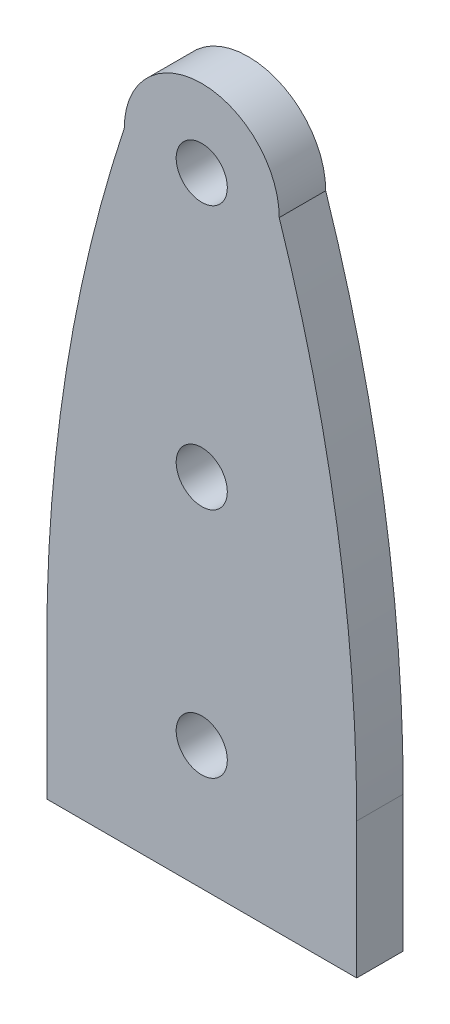
ISO-10303-21;
HEADER;
FILE_DESCRIPTION(('STEP AP214'),'2;1');
FILE_NAME('part.step','',(''),(''),'','','');
FILE_SCHEMA(('AUTOMOTIVE_DESIGN { 1 0 10303 214 1 1 1 1 }'));
ENDSEC;
DATA;
#1=APPLICATION_CONTEXT('core data for automotive mechanical design processes');
#2=APPLICATION_PROTOCOL_DEFINITION('international standard','automotive_design',2000,#1);
#3=PRODUCT_CONTEXT('',#1,'mechanical');
#4=PRODUCT('Part','Part','',(#3));
#5=PRODUCT_RELATED_PRODUCT_CATEGORY('part','',(#4));
#6=PRODUCT_DEFINITION_FORMATION('','',#4);
#7=PRODUCT_DEFINITION_CONTEXT('part definition',#1,'design');
#8=PRODUCT_DEFINITION('design','',#6,#7);
#9=PRODUCT_DEFINITION_SHAPE('','',#8);
#10=(LENGTH_UNIT() NAMED_UNIT(*) SI_UNIT(.MILLI.,.METRE.));
#11=(NAMED_UNIT(*) PLANE_ANGLE_UNIT() SI_UNIT($,.RADIAN.));
#12=(NAMED_UNIT(*) SI_UNIT($,.STERADIAN.) SOLID_ANGLE_UNIT());
#13=UNCERTAINTY_MEASURE_WITH_UNIT(LENGTH_MEASURE(1.E-05),#10,'distance_accuracy_value','');
#14=(GEOMETRIC_REPRESENTATION_CONTEXT(3) GLOBAL_UNCERTAINTY_ASSIGNED_CONTEXT((#13)) GLOBAL_UNIT_ASSIGNED_CONTEXT((#10,
#11,#12)) REPRESENTATION_CONTEXT('',''));
#15=CARTESIAN_POINT('',(0.,0.,0.));
#16=DIRECTION('',(0.,0.,1.));
#17=DIRECTION('',(1.,0.,0.));
#18=AXIS2_PLACEMENT_3D('',#15,#16,#17);
#19=CARTESIAN_POINT('',(10.,40.,3.));
#20=DIRECTION('',(0.,0.,1.));
#21=DIRECTION('',(1.,0.,0.));
#22=AXIS2_PLACEMENT_3D('',#19,#20,#21);
#23=PLANE('',#22);
#24=CARTESIAN_POINT('',(10.,40.,3.));
#25=DIRECTION('',(0.,0.,-1.));
#26=DIRECTION('',(1.,0.,0.));
#27=AXIS2_PLACEMENT_3D('',#24,#25,#26);
#28=CIRCLE('',#27,5.);
#29=CARTESIAN_POINT('',(5.,40.,3.));
#30=VERTEX_POINT('',#29);
#31=CARTESIAN_POINT('',(15.,40.,3.));
#32=VERTEX_POINT('',#31);
#33=EDGE_CURVE('E92',#30,#32,#28,.T.);
#34=ORIENTED_EDGE('',*,*,#33,.F.);
#35=CARTESIAN_POINT('',(100.,8.77501000800804,3.));
#36=DIRECTION('',(0.,0.,1.));
#37=DIRECTION('',(1.,0.,0.));
#38=AXIS2_PLACEMENT_3D('',#35,#36,#37);
#39=CIRCLE('',#38,100.);
#40=CARTESIAN_POINT('',(0.,8.77501000800804,3.));
#41=VERTEX_POINT('',#40);
#42=EDGE_CURVE('E42',#30,#41,#39,.T.);
#43=ORIENTED_EDGE('',*,*,#42,.T.);
#44=DIRECTION('',(0.,-1.,0.));
#45=VECTOR('',#44,1.);
#46=CARTESIAN_POINT('',(0.,40.,3.));
#47=LINE('',#46,#45);
#48=CARTESIAN_POINT('',(0.,0.,3.));
#49=VERTEX_POINT('',#48);
#50=EDGE_CURVE('E125',#41,#49,#47,.T.);
#51=ORIENTED_EDGE('',*,*,#50,.T.);
#52=DIRECTION('',(1.,0.,0.));
#53=VECTOR('',#52,1.);
#54=CARTESIAN_POINT('',(0.,0.,3.));
#55=LINE('',#54,#53);
#56=CARTESIAN_POINT('',(20.,0.,3.));
#57=VERTEX_POINT('',#56);
#58=EDGE_CURVE('E132',#49,#57,#55,.T.);
#59=ORIENTED_EDGE('',*,*,#58,.T.);
#60=DIRECTION('',(0.,1.,0.));
#61=VECTOR('',#60,1.);
#62=CARTESIAN_POINT('',(20.,0.,3.));
#63=LINE('',#62,#61);
#64=CARTESIAN_POINT('',(20.,8.77501000800798,3.));
#65=VERTEX_POINT('',#64);
#66=EDGE_CURVE('E122',#57,#65,#63,.T.);
#67=ORIENTED_EDGE('',*,*,#66,.T.);
#68=CARTESIAN_POINT('',(-80.,8.77501000800798,3.));
#69=DIRECTION('',(0.,0.,1.));
#70=DIRECTION('',(1.,0.,0.));
#71=AXIS2_PLACEMENT_3D('',#68,#69,#70);
#72=CIRCLE('',#71,100.);
#73=EDGE_CURVE('E103',#65,#32,#72,.T.);
#74=ORIENTED_EDGE('',*,*,#73,.T.);
#75=EDGE_LOOP('',(#34,#43,#51,#59,#67,#74));
#76=FACE_BOUND('',#75,.T.);
#77=CARTESIAN_POINT('',(10.,8.,3.));
#78=DIRECTION('',(0.,0.,1.));
#79=DIRECTION('',(1.,0.,0.));
#80=AXIS2_PLACEMENT_3D('',#77,#78,#79);
#81=CIRCLE('',#80,1.65);
#82=CARTESIAN_POINT('',(11.65,8.,3.));
#83=VERTEX_POINT('',#82);
#84=EDGE_CURVE('E138',#83,#83,#81,.T.);
#85=ORIENTED_EDGE('',*,*,#84,.F.);
#86=EDGE_LOOP('',(#85));
#87=FACE_BOUND('',#86,.T.);
#88=CARTESIAN_POINT('',(10.,40.,3.));
#89=DIRECTION('',(0.,0.,1.));
#90=DIRECTION('',(1.,0.,0.));
#91=AXIS2_PLACEMENT_3D('',#88,#89,#90);
#92=CIRCLE('',#91,1.65);
#93=CARTESIAN_POINT('',(11.65,40.,3.));
#94=VERTEX_POINT('',#93);
#95=EDGE_CURVE('E130',#94,#94,#92,.T.);
#96=ORIENTED_EDGE('',*,*,#95,.F.);
#97=EDGE_LOOP('',(#96));
#98=FACE_BOUND('',#97,.T.);
#99=CARTESIAN_POINT('',(10.,23.,3.));
#100=DIRECTION('',(0.,0.,1.));
#101=DIRECTION('',(1.,0.,0.));
#102=AXIS2_PLACEMENT_3D('',#99,#100,#101);
#103=CIRCLE('',#102,1.65);
#104=CARTESIAN_POINT('',(11.65,23.,3.));
#105=VERTEX_POINT('',#104);
#106=EDGE_CURVE('E144',#105,#105,#103,.T.);
#107=ORIENTED_EDGE('',*,*,#106,.F.);
#108=EDGE_LOOP('',(#107));
#109=FACE_BOUND('',#108,.T.);
#110=ADVANCED_FACE('F34',(#76,#87,#98,#109),#23,.T.);
#111=CARTESIAN_POINT('',(10.,40.,0.));
#112=DIRECTION('',(0.,0.,1.));
#113=DIRECTION('',(1.,0.,0.));
#114=AXIS2_PLACEMENT_3D('',#111,#112,#113);
#115=PLANE('',#114);
#116=DIRECTION('',(0.,-1.,0.));
#117=VECTOR('',#116,1.);
#118=CARTESIAN_POINT('',(0.,40.,0.));
#119=LINE('',#118,#117);
#120=CARTESIAN_POINT('',(0.,8.77501000800804,0.));
#121=VERTEX_POINT('',#120);
#122=CARTESIAN_POINT('',(0.,0.,0.));
#123=VERTEX_POINT('',#122);
#124=EDGE_CURVE('E128',#121,#123,#119,.T.);
#125=ORIENTED_EDGE('',*,*,#124,.F.);
#126=CARTESIAN_POINT('',(100.,8.77501000800804,0.));
#127=DIRECTION('',(0.,0.,1.));
#128=DIRECTION('',(1.,0.,0.));
#129=AXIS2_PLACEMENT_3D('',#126,#127,#128);
#130=CIRCLE('',#129,100.);
#131=CARTESIAN_POINT('',(5.,40.,0.));
#132=VERTEX_POINT('',#131);
#133=EDGE_CURVE('E109',#121,#132,#130,.F.);
#134=ORIENTED_EDGE('',*,*,#133,.T.);
#135=CARTESIAN_POINT('',(10.,40.,0.));
#136=DIRECTION('',(0.,0.,1.));
#137=DIRECTION('',(1.,0.,0.));
#138=AXIS2_PLACEMENT_3D('',#135,#136,#137);
#139=CIRCLE('',#138,5.);
#140=CARTESIAN_POINT('',(15.,40.,0.));
#141=VERTEX_POINT('',#140);
#142=EDGE_CURVE('E94',#132,#141,#139,.F.);
#143=ORIENTED_EDGE('',*,*,#142,.T.);
#144=CARTESIAN_POINT('',(-80.,8.77501000800798,0.));
#145=DIRECTION('',(0.,0.,1.));
#146=DIRECTION('',(1.,0.,0.));
#147=AXIS2_PLACEMENT_3D('',#144,#145,#146);
#148=CIRCLE('',#147,100.);
#149=CARTESIAN_POINT('',(20.,8.77501000800798,0.));
#150=VERTEX_POINT('',#149);
#151=EDGE_CURVE('E55',#141,#150,#148,.F.);
#152=ORIENTED_EDGE('',*,*,#151,.T.);
#153=DIRECTION('',(0.,1.,0.));
#154=VECTOR('',#153,1.);
#155=CARTESIAN_POINT('',(20.,0.,0.));
#156=LINE('',#155,#154);
#157=CARTESIAN_POINT('',(20.,0.,0.));
#158=VERTEX_POINT('',#157);
#159=EDGE_CURVE('E123',#158,#150,#156,.T.);
#160=ORIENTED_EDGE('',*,*,#159,.F.);
#161=DIRECTION('',(1.,0.,0.));
#162=VECTOR('',#161,1.);
#163=CARTESIAN_POINT('',(0.,0.,0.));
#164=LINE('',#163,#162);
#165=EDGE_CURVE('E126',#123,#158,#164,.T.);
#166=ORIENTED_EDGE('',*,*,#165,.F.);
#167=EDGE_LOOP('',(#125,#134,#143,#152,#160,#166));
#168=FACE_BOUND('',#167,.T.);
#169=CARTESIAN_POINT('',(10.,40.,0.));
#170=DIRECTION('',(0.,0.,1.));
#171=DIRECTION('',(1.,0.,0.));
#172=AXIS2_PLACEMENT_3D('',#169,#170,#171);
#173=CIRCLE('',#172,1.65);
#174=CARTESIAN_POINT('',(11.65,40.,0.));
#175=VERTEX_POINT('',#174);
#176=EDGE_CURVE('E135',#175,#175,#173,.T.);
#177=ORIENTED_EDGE('',*,*,#176,.T.);
#178=EDGE_LOOP('',(#177));
#179=FACE_BOUND('',#178,.T.);
#180=CARTESIAN_POINT('',(10.,8.,0.));
#181=DIRECTION('',(0.,0.,1.));
#182=DIRECTION('',(1.,0.,0.));
#183=AXIS2_PLACEMENT_3D('',#180,#181,#182);
#184=CIRCLE('',#183,1.65);
#185=CARTESIAN_POINT('',(11.65,8.,0.));
#186=VERTEX_POINT('',#185);
#187=EDGE_CURVE('E141',#186,#186,#184,.T.);
#188=ORIENTED_EDGE('',*,*,#187,.T.);
#189=EDGE_LOOP('',(#188));
#190=FACE_BOUND('',#189,.T.);
#191=CARTESIAN_POINT('',(10.,23.,0.));
#192=DIRECTION('',(0.,0.,1.));
#193=DIRECTION('',(1.,0.,0.));
#194=AXIS2_PLACEMENT_3D('',#191,#192,#193);
#195=CIRCLE('',#194,1.65);
#196=CARTESIAN_POINT('',(11.65,23.,0.));
#197=VERTEX_POINT('',#196);
#198=EDGE_CURVE('E147',#197,#197,#195,.T.);
#199=ORIENTED_EDGE('',*,*,#198,.T.);
#200=EDGE_LOOP('',(#199));
#201=FACE_BOUND('',#200,.T.);
#202=ADVANCED_FACE('F154',(#168,#179,#190,#201),#115,.F.);
#203=CARTESIAN_POINT('',(0.,40.,3.));
#204=DIRECTION('',(1.,0.,0.));
#205=DIRECTION('',(0.,0.,-1.));
#206=AXIS2_PLACEMENT_3D('',#203,#204,#205);
#207=PLANE('',#206);
#208=ORIENTED_EDGE('',*,*,#50,.F.);
#209=DIRECTION('',(0.,0.,1.));
#210=VECTOR('',#209,1.);
#211=CARTESIAN_POINT('',(0.,8.77501000800804,3.));
#212=LINE('',#211,#210);
#213=EDGE_CURVE('E108',#41,#121,#212,.F.);
#214=ORIENTED_EDGE('',*,*,#213,.T.);
#215=ORIENTED_EDGE('',*,*,#124,.T.);
#216=DIRECTION('',(0.,0.,-1.));
#217=VECTOR('',#216,1.);
#218=CARTESIAN_POINT('',(0.,0.,3.));
#219=LINE('',#218,#217);
#220=EDGE_CURVE('E116',#49,#123,#219,.T.);
#221=ORIENTED_EDGE('',*,*,#220,.F.);
#222=EDGE_LOOP('',(#208,#214,#215,#221));
#223=FACE_BOUND('',#222,.T.);
#224=ADVANCED_FACE('F158',(#223),#207,.F.);
#225=CARTESIAN_POINT('',(0.,0.,3.));
#226=DIRECTION('',(0.,1.,0.));
#227=DIRECTION('',(0.,0.,1.));
#228=AXIS2_PLACEMENT_3D('',#225,#226,#227);
#229=PLANE('',#228);
#230=ORIENTED_EDGE('',*,*,#165,.T.);
#231=DIRECTION('',(0.,0.,-1.));
#232=VECTOR('',#231,1.);
#233=CARTESIAN_POINT('',(20.,0.,3.));
#234=LINE('',#233,#232);
#235=EDGE_CURVE('E119',#57,#158,#234,.T.);
#236=ORIENTED_EDGE('',*,*,#235,.F.);
#237=ORIENTED_EDGE('',*,*,#58,.F.);
#238=ORIENTED_EDGE('',*,*,#220,.T.);
#239=EDGE_LOOP('',(#230,#236,#237,#238));
#240=FACE_BOUND('',#239,.T.);
#241=ADVANCED_FACE('F163',(#240),#229,.F.);
#242=CARTESIAN_POINT('',(20.,0.,3.));
#243=DIRECTION('',(-1.,0.,0.));
#244=DIRECTION('',(0.,0.,1.));
#245=AXIS2_PLACEMENT_3D('',#242,#243,#244);
#246=PLANE('',#245);
#247=ORIENTED_EDGE('',*,*,#159,.T.);
#248=DIRECTION('',(0.,0.,1.));
#249=VECTOR('',#248,1.);
#250=CARTESIAN_POINT('',(20.,8.77501000800798,3.));
#251=LINE('',#250,#249);
#252=EDGE_CURVE('E11',#150,#65,#251,.T.);
#253=ORIENTED_EDGE('',*,*,#252,.T.);
#254=ORIENTED_EDGE('',*,*,#66,.F.);
#255=ORIENTED_EDGE('',*,*,#235,.T.);
#256=EDGE_LOOP('',(#247,#253,#254,#255));
#257=FACE_BOUND('',#256,.T.);
#258=ADVANCED_FACE('F164',(#257),#246,.F.);
#259=CARTESIAN_POINT('',(10.,40.,3.));
#260=DIRECTION('',(0.,0.,-1.));
#261=DIRECTION('',(-1.,0.,0.));
#262=AXIS2_PLACEMENT_3D('',#259,#260,#261);
#263=CYLINDRICAL_SURFACE('',#262,1.65);
#264=ORIENTED_EDGE('',*,*,#95,.T.);
#265=EDGE_LOOP('',(#264));
#266=FACE_BOUND('',#265,.T.);
#267=ORIENTED_EDGE('',*,*,#176,.F.);
#268=EDGE_LOOP('',(#267));
#269=FACE_BOUND('',#268,.T.);
#270=ADVANCED_FACE('F166',(#266,#269),#263,.F.);
#271=CARTESIAN_POINT('',(10.,8.,3.));
#272=DIRECTION('',(0.,0.,-1.));
#273=DIRECTION('',(-1.,0.,0.));
#274=AXIS2_PLACEMENT_3D('',#271,#272,#273);
#275=CYLINDRICAL_SURFACE('',#274,1.65);
#276=ORIENTED_EDGE('',*,*,#84,.T.);
#277=EDGE_LOOP('',(#276));
#278=FACE_BOUND('',#277,.T.);
#279=ORIENTED_EDGE('',*,*,#187,.F.);
#280=EDGE_LOOP('',(#279));
#281=FACE_BOUND('',#280,.T.);
#282=ADVANCED_FACE('F172',(#278,#281),#275,.F.);
#283=CARTESIAN_POINT('',(10.,23.,3.));
#284=DIRECTION('',(0.,0.,-1.));
#285=DIRECTION('',(-1.,0.,0.));
#286=AXIS2_PLACEMENT_3D('',#283,#284,#285);
#287=CYLINDRICAL_SURFACE('',#286,1.65);
#288=ORIENTED_EDGE('',*,*,#106,.T.);
#289=EDGE_LOOP('',(#288));
#290=FACE_BOUND('',#289,.T.);
#291=ORIENTED_EDGE('',*,*,#198,.F.);
#292=EDGE_LOOP('',(#291));
#293=FACE_BOUND('',#292,.T.);
#294=ADVANCED_FACE('F185',(#290,#293),#287,.F.);
#295=CARTESIAN_POINT('',(10.,40.,-25.));
#296=DIRECTION('',(0.,0.,1.));
#297=DIRECTION('',(1.,0.,0.));
#298=AXIS2_PLACEMENT_3D('',#295,#296,#297);
#299=CYLINDRICAL_SURFACE('',#298,5.);
#300=DIRECTION('',(0.,0.,1.));
#301=VECTOR('',#300,1.);
#302=CARTESIAN_POINT('',(5.,40.,-25.));
#303=LINE('',#302,#301);
#304=EDGE_CURVE('E88',#132,#30,#303,.T.);
#305=ORIENTED_EDGE('',*,*,#304,.T.);
#306=ORIENTED_EDGE('',*,*,#33,.T.);
#307=DIRECTION('',(0.,0.,1.));
#308=VECTOR('',#307,1.);
#309=CARTESIAN_POINT('',(15.,40.,-25.));
#310=LINE('',#309,#308);
#311=EDGE_CURVE('E97',#141,#32,#310,.T.);
#312=ORIENTED_EDGE('',*,*,#311,.F.);
#313=ORIENTED_EDGE('',*,*,#142,.F.);
#314=EDGE_LOOP('',(#305,#306,#312,#313));
#315=FACE_BOUND('',#314,.T.);
#316=ADVANCED_FACE('F90',(#315),#299,.T.);
#317=CARTESIAN_POINT('',(100.,8.77501000800804,-25.));
#318=DIRECTION('',(0.,0.,1.));
#319=DIRECTION('',(1.,0.,0.));
#320=AXIS2_PLACEMENT_3D('',#317,#318,#319);
#321=CYLINDRICAL_SURFACE('',#320,100.);
#322=ORIENTED_EDGE('',*,*,#42,.F.);
#323=ORIENTED_EDGE('',*,*,#304,.F.);
#324=ORIENTED_EDGE('',*,*,#133,.F.);
#325=ORIENTED_EDGE('',*,*,#213,.F.);
#326=EDGE_LOOP('',(#322,#323,#324,#325));
#327=FACE_BOUND('',#326,.T.);
#328=ADVANCED_FACE('F106',(#327),#321,.T.);
#329=CARTESIAN_POINT('',(-80.,8.77501000800798,-25.));
#330=DIRECTION('',(0.,0.,1.));
#331=DIRECTION('',(1.,0.,0.));
#332=AXIS2_PLACEMENT_3D('',#329,#330,#331);
#333=CYLINDRICAL_SURFACE('',#332,100.);
#334=ORIENTED_EDGE('',*,*,#73,.F.);
#335=ORIENTED_EDGE('',*,*,#252,.F.);
#336=ORIENTED_EDGE('',*,*,#151,.F.);
#337=ORIENTED_EDGE('',*,*,#311,.T.);
#338=EDGE_LOOP('',(#334,#335,#336,#337));
#339=FACE_BOUND('',#338,.T.);
#340=ADVANCED_FACE('F36',(#339),#333,.T.);
#341=CLOSED_SHELL('',(#110,#202,#224,#241,#258,#270,#282,#294,#316,#328,#340));
#342=MANIFOLD_SOLID_BREP('B2',#341);
#343=ADVANCED_BREP_SHAPE_REPRESENTATION('',(#18,#342),#14);
#344=SHAPE_DEFINITION_REPRESENTATION(#9,#343);
ENDSEC;
END-ISO-10303-21;
